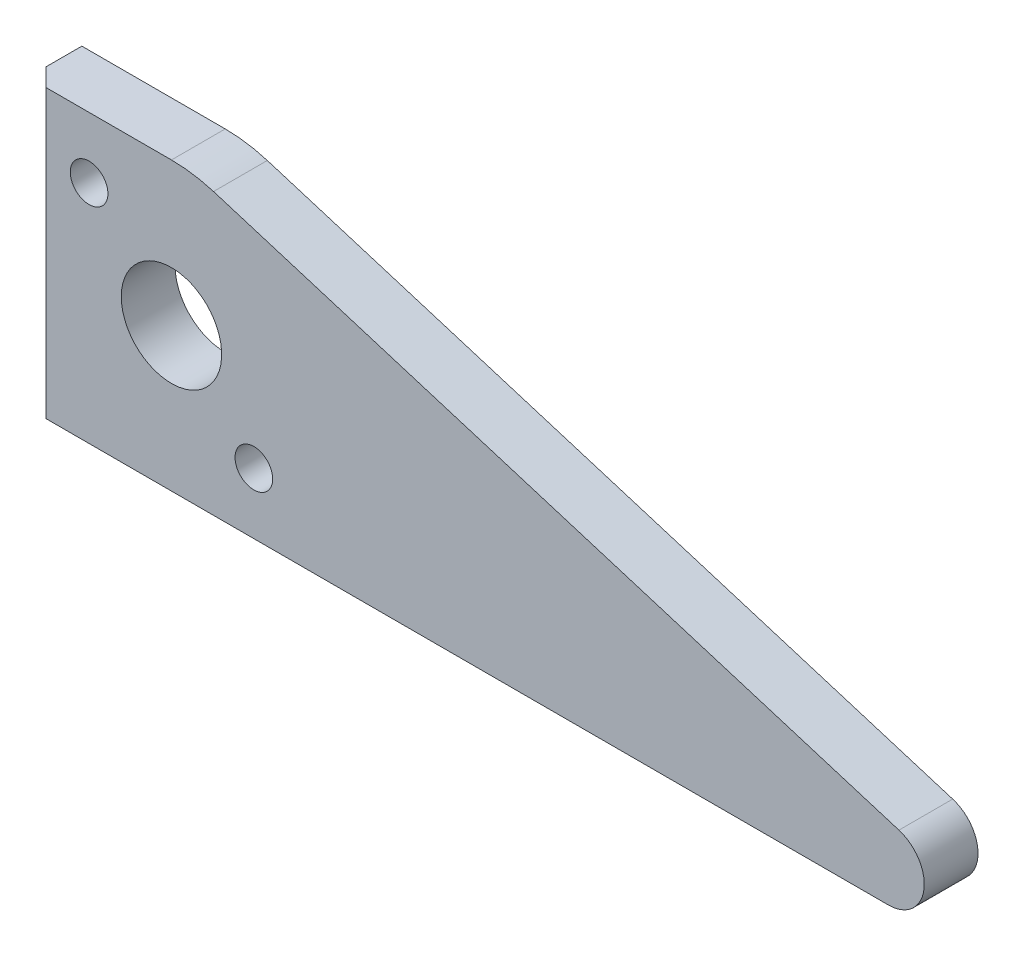
ISO-10303-21;
HEADER;
FILE_DESCRIPTION(('STEP AP214'),'2;1');
FILE_NAME('part.step','',(''),(''),'','','');
FILE_SCHEMA(('AUTOMOTIVE_DESIGN { 1 0 10303 214 1 1 1 1 }'));
ENDSEC;
DATA;
#1=APPLICATION_CONTEXT('core data for automotive mechanical design processes');
#2=APPLICATION_PROTOCOL_DEFINITION('international standard','automotive_design',2000,#1);
#3=PRODUCT_CONTEXT('',#1,'mechanical');
#4=PRODUCT('Part','Part','',(#3));
#5=PRODUCT_RELATED_PRODUCT_CATEGORY('part','',(#4));
#6=PRODUCT_DEFINITION_FORMATION('','',#4);
#7=PRODUCT_DEFINITION_CONTEXT('part definition',#1,'design');
#8=PRODUCT_DEFINITION('design','',#6,#7);
#9=PRODUCT_DEFINITION_SHAPE('','',#8);
#10=(LENGTH_UNIT() NAMED_UNIT(*) SI_UNIT(.MILLI.,.METRE.));
#11=(NAMED_UNIT(*) PLANE_ANGLE_UNIT() SI_UNIT($,.RADIAN.));
#12=(NAMED_UNIT(*) SI_UNIT($,.STERADIAN.) SOLID_ANGLE_UNIT());
#13=UNCERTAINTY_MEASURE_WITH_UNIT(LENGTH_MEASURE(1.E-05),#10,'distance_accuracy_value','');
#14=(GEOMETRIC_REPRESENTATION_CONTEXT(3) GLOBAL_UNCERTAINTY_ASSIGNED_CONTEXT((#13)) GLOBAL_UNIT_ASSIGNED_CONTEXT((#10,
#11,#12)) REPRESENTATION_CONTEXT('',''));
#15=CARTESIAN_POINT('',(0.,0.,0.));
#16=DIRECTION('',(0.,0.,1.));
#17=DIRECTION('',(1.,0.,0.));
#18=AXIS2_PLACEMENT_3D('',#15,#16,#17);
#19=CARTESIAN_POINT('',(-22.9809703885628,22.9809703885628,-5.));
#20=DIRECTION('',(0.,0.,1.));
#21=DIRECTION('',(1.,0.,0.));
#22=AXIS2_PLACEMENT_3D('',#19,#20,#21);
#23=CYLINDRICAL_SURFACE('',#22,3.);
#24=CARTESIAN_POINT('',(-22.9809703885628,22.9809703885628,0.));
#25=DIRECTION('',(0.,0.,1.));
#26=DIRECTION('',(1.,0.,0.));
#27=AXIS2_PLACEMENT_3D('',#24,#25,#26);
#28=CIRCLE('',#27,3.);
#29=CARTESIAN_POINT('',(-19.9809703885628,22.9809703885628,0.));
#30=VERTEX_POINT('',#29);
#31=EDGE_CURVE('E150',#30,#30,#28,.T.);
#32=ORIENTED_EDGE('',*,*,#31,.F.);
#33=EDGE_LOOP('',(#32));
#34=FACE_BOUND('',#33,.T.);
#35=CARTESIAN_POINT('',(-22.9809703885628,22.9809703885628,6.5));
#36=DIRECTION('',(0.,0.,1.));
#37=DIRECTION('',(1.,0.,0.));
#38=AXIS2_PLACEMENT_3D('',#35,#36,#37);
#39=CIRCLE('',#38,3.);
#40=CARTESIAN_POINT('',(-19.9809703885628,22.9809703885628,6.5));
#41=VERTEX_POINT('',#40);
#42=EDGE_CURVE('E139',#41,#41,#39,.F.);
#43=ORIENTED_EDGE('',*,*,#42,.F.);
#44=EDGE_LOOP('',(#43));
#45=FACE_BOUND('',#44,.T.);
#46=ADVANCED_FACE('F32',(#34,#45),#23,.F.);
#47=CARTESIAN_POINT('',(-40.,40.,15.));
#48=DIRECTION('',(1.,0.,0.));
#49=DIRECTION('',(0.,1.,0.));
#50=AXIS2_PLACEMENT_3D('',#47,#48,#49);
#51=PLANE('',#50);
#52=DIRECTION('',(0.,0.,-1.));
#53=VECTOR('',#52,1.);
#54=CARTESIAN_POINT('',(-40.,-40.,15.));
#55=LINE('',#54,#53);
#56=CARTESIAN_POINT('',(-40.,-40.,9.99999999999997));
#57=VERTEX_POINT('',#56);
#58=CARTESIAN_POINT('',(-40.,-40.,0.));
#59=VERTEX_POINT('',#58);
#60=EDGE_CURVE('E169',#57,#59,#55,.T.);
#61=ORIENTED_EDGE('',*,*,#60,.F.);
#62=DIRECTION('',(0.,1.,0.));
#63=VECTOR('',#62,1.);
#64=CARTESIAN_POINT('',(-40.,40.,9.99999999999997));
#65=LINE('',#64,#63);
#66=CARTESIAN_POINT('',(-40.,40.,9.99999999999997));
#67=VERTEX_POINT('',#66);
#68=EDGE_CURVE('E41',#57,#67,#65,.T.);
#69=ORIENTED_EDGE('',*,*,#68,.T.);
#70=DIRECTION('',(0.,0.,-1.));
#71=VECTOR('',#70,1.);
#72=CARTESIAN_POINT('',(-40.,40.,15.));
#73=LINE('',#72,#71);
#74=CARTESIAN_POINT('',(-40.,40.,0.));
#75=VERTEX_POINT('',#74);
#76=EDGE_CURVE('E156',#67,#75,#73,.T.);
#77=ORIENTED_EDGE('',*,*,#76,.T.);
#78=DIRECTION('',(0.,-1.,0.));
#79=VECTOR('',#78,1.);
#80=CARTESIAN_POINT('',(-40.,40.,0.));
#81=LINE('',#80,#79);
#82=EDGE_CURVE('E146',#75,#59,#81,.T.);
#83=ORIENTED_EDGE('',*,*,#82,.T.);
#84=EDGE_LOOP('',(#61,#69,#77,#83));
#85=FACE_BOUND('',#84,.T.);
#86=ADVANCED_FACE('F186',(#85),#51,.F.);
#87=CARTESIAN_POINT('',(-40.,-40.,15.));
#88=DIRECTION('',(0.,1.,0.));
#89=DIRECTION('',(0.,0.,1.));
#90=AXIS2_PLACEMENT_3D('',#87,#88,#89);
#91=PLANE('',#90);
#92=DIRECTION('',(1.,0.,0.));
#93=VECTOR('',#92,1.);
#94=CARTESIAN_POINT('',(-40.,-40.,15.));
#95=LINE('',#94,#93);
#96=CARTESIAN_POINT('',(-35.,-40.,15.));
#97=VERTEX_POINT('',#96);
#98=CARTESIAN_POINT('',(200.,-40.,15.));
#99=VERTEX_POINT('',#98);
#100=EDGE_CURVE('E115',#97,#99,#95,.T.);
#101=ORIENTED_EDGE('',*,*,#100,.F.);
#102=DIRECTION('',(-0.707106781186546,0.,-0.707106781186549));
#103=VECTOR('',#102,1.);
#104=CARTESIAN_POINT('',(-35.,-40.,15.));
#105=LINE('',#104,#103);
#106=EDGE_CURVE('E173',#97,#57,#105,.T.);
#107=ORIENTED_EDGE('',*,*,#106,.T.);
#108=ORIENTED_EDGE('',*,*,#60,.T.);
#109=DIRECTION('',(1.,0.,0.));
#110=VECTOR('',#109,1.);
#111=CARTESIAN_POINT('',(-40.,-40.,0.));
#112=LINE('',#111,#110);
#113=CARTESIAN_POINT('',(200.,-40.,0.));
#114=VERTEX_POINT('',#113);
#115=EDGE_CURVE('E159',#59,#114,#112,.T.);
#116=ORIENTED_EDGE('',*,*,#115,.T.);
#117=DIRECTION('',(0.,0.,1.));
#118=VECTOR('',#117,1.);
#119=CARTESIAN_POINT('',(200.,-40.,-224.101397553614));
#120=LINE('',#119,#118);
#121=EDGE_CURVE('E125',#114,#99,#120,.T.);
#122=ORIENTED_EDGE('',*,*,#121,.T.);
#123=EDGE_LOOP('',(#101,#107,#108,#116,#122));
#124=FACE_BOUND('',#123,.T.);
#125=ADVANCED_FACE('F192',(#124),#91,.F.);
#126=CARTESIAN_POINT('',(0.,0.,15.));
#127=DIRECTION('',(0.,0.,-1.));
#128=DIRECTION('',(-1.,0.,0.));
#129=AXIS2_PLACEMENT_3D('',#126,#127,#128);
#130=CYLINDRICAL_SURFACE('',#129,40.);
#131=CARTESIAN_POINT('',(0.,0.,15.));
#132=DIRECTION('',(0.,0.,1.));
#133=DIRECTION('',(1.,0.,0.));
#134=AXIS2_PLACEMENT_3D('',#131,#132,#133);
#135=CIRCLE('',#134,40.);
#136=CARTESIAN_POINT('',(11.7359413202934,38.239608801956,15.));
#137=VERTEX_POINT('',#136);
#138=CARTESIAN_POINT('',(0.,40.,15.));
#139=VERTEX_POINT('',#138);
#140=EDGE_CURVE('E49',#137,#139,#135,.T.);
#141=ORIENTED_EDGE('',*,*,#140,.F.);
#142=DIRECTION('',(0.,0.,1.));
#143=VECTOR('',#142,1.);
#144=CARTESIAN_POINT('',(11.7359413202934,38.239608801956,-224.101397553614));
#145=LINE('',#144,#143);
#146=CARTESIAN_POINT('',(11.7359413202934,38.239608801956,0.));
#147=VERTEX_POINT('',#146);
#148=EDGE_CURVE('E104',#147,#137,#145,.T.);
#149=ORIENTED_EDGE('',*,*,#148,.F.);
#150=CARTESIAN_POINT('',(0.,0.,0.));
#151=DIRECTION('',(0.,0.,1.));
#152=DIRECTION('',(1.,0.,0.));
#153=AXIS2_PLACEMENT_3D('',#150,#151,#152);
#154=CIRCLE('',#153,40.);
#155=CARTESIAN_POINT('',(0.,40.,0.));
#156=VERTEX_POINT('',#155);
#157=EDGE_CURVE('E161',#147,#156,#154,.T.);
#158=ORIENTED_EDGE('',*,*,#157,.T.);
#159=DIRECTION('',(0.,0.,-1.));
#160=VECTOR('',#159,1.);
#161=CARTESIAN_POINT('',(0.,40.,15.));
#162=LINE('',#161,#160);
#163=EDGE_CURVE('E166',#139,#156,#162,.T.);
#164=ORIENTED_EDGE('',*,*,#163,.F.);
#165=EDGE_LOOP('',(#141,#149,#158,#164));
#166=FACE_BOUND('',#165,.T.);
#167=ADVANCED_FACE('F212',(#166),#130,.T.);
#168=CARTESIAN_POINT('',(-40.,40.,15.));
#169=DIRECTION('',(0.,-1.,0.));
#170=DIRECTION('',(1.,0.,0.));
#171=AXIS2_PLACEMENT_3D('',#168,#169,#170);
#172=PLANE('',#171);
#173=ORIENTED_EDGE('',*,*,#76,.F.);
#174=DIRECTION('',(0.707106781186546,0.,0.707106781186549));
#175=VECTOR('',#174,1.);
#176=CARTESIAN_POINT('',(-35.,40.,15.));
#177=LINE('',#176,#175);
#178=CARTESIAN_POINT('',(-35.,40.,15.));
#179=VERTEX_POINT('',#178);
#180=EDGE_CURVE('E11',#67,#179,#177,.T.);
#181=ORIENTED_EDGE('',*,*,#180,.T.);
#182=DIRECTION('',(-1.,0.,0.));
#183=VECTOR('',#182,1.);
#184=CARTESIAN_POINT('',(-40.,40.,15.));
#185=LINE('',#184,#183);
#186=EDGE_CURVE('E154',#139,#179,#185,.T.);
#187=ORIENTED_EDGE('',*,*,#186,.F.);
#188=ORIENTED_EDGE('',*,*,#163,.T.);
#189=DIRECTION('',(-1.,0.,0.));
#190=VECTOR('',#189,1.);
#191=CARTESIAN_POINT('',(-40.,40.,0.));
#192=LINE('',#191,#190);
#193=EDGE_CURVE('E152',#156,#75,#192,.T.);
#194=ORIENTED_EDGE('',*,*,#193,.T.);
#195=EDGE_LOOP('',(#173,#181,#187,#188,#194));
#196=FACE_BOUND('',#195,.T.);
#197=ADVANCED_FACE('F205',(#196),#172,.F.);
#198=CARTESIAN_POINT('',(0.,0.,15.));
#199=DIRECTION('',(0.,0.,1.));
#200=DIRECTION('',(1.,0.,0.));
#201=AXIS2_PLACEMENT_3D('',#198,#199,#200);
#202=PLANE('',#201);
#203=CARTESIAN_POINT('',(22.9809703885627,-22.9809703885628,15.));
#204=DIRECTION('',(0.,0.,1.));
#205=DIRECTION('',(-1.,0.,0.));
#206=AXIS2_PLACEMENT_3D('',#203,#204,#205);
#207=CIRCLE('',#206,5.25);
#208=CARTESIAN_POINT('',(17.7309703885627,-22.9809703885628,15.));
#209=VERTEX_POINT('',#208);
#210=EDGE_CURVE('E130',#209,#209,#207,.T.);
#211=ORIENTED_EDGE('',*,*,#210,.F.);
#212=EDGE_LOOP('',(#211));
#213=FACE_BOUND('',#212,.T.);
#214=CARTESIAN_POINT('',(-22.9809703885628,22.9809703885628,15.));
#215=DIRECTION('',(0.,0.,1.));
#216=DIRECTION('',(1.,0.,0.));
#217=AXIS2_PLACEMENT_3D('',#214,#215,#216);
#218=CIRCLE('',#217,5.25);
#219=CARTESIAN_POINT('',(-17.7309703885628,22.9809703885628,15.));
#220=VERTEX_POINT('',#219);
#221=EDGE_CURVE('E140',#220,#220,#218,.T.);
#222=ORIENTED_EDGE('',*,*,#221,.F.);
#223=EDGE_LOOP('',(#222));
#224=FACE_BOUND('',#223,.T.);
#225=CARTESIAN_POINT('',(0.,0.,15.));
#226=DIRECTION('',(0.,0.,-1.));
#227=DIRECTION('',(-1.,0.,0.));
#228=AXIS2_PLACEMENT_3D('',#225,#226,#227);
#229=CIRCLE('',#228,14.);
#230=CARTESIAN_POINT('',(-14.,0.,15.));
#231=VERTEX_POINT('',#230);
#232=EDGE_CURVE('E143',#231,#231,#229,.T.);
#233=ORIENTED_EDGE('',*,*,#232,.T.);
#234=EDGE_LOOP('',(#233));
#235=FACE_BOUND('',#234,.T.);
#236=ORIENTED_EDGE('',*,*,#186,.T.);
#237=DIRECTION('',(0.,-1.,0.));
#238=VECTOR('',#237,1.);
#239=CARTESIAN_POINT('',(-35.,-40.,15.));
#240=LINE('',#239,#238);
#241=EDGE_CURVE('E171',#179,#97,#240,.T.);
#242=ORIENTED_EDGE('',*,*,#241,.T.);
#243=ORIENTED_EDGE('',*,*,#100,.T.);
#244=CARTESIAN_POINT('',(200.,-30.,15.));
#245=DIRECTION('',(0.,0.,1.));
#246=DIRECTION('',(1.,0.,0.));
#247=AXIS2_PLACEMENT_3D('',#244,#245,#246);
#248=CIRCLE('',#247,9.99999999999999);
#249=CARTESIAN_POINT('',(202.933985330073,-20.440097799511,15.));
#250=VERTEX_POINT('',#249);
#251=EDGE_CURVE('E99',#99,#250,#248,.T.);
#252=ORIENTED_EDGE('',*,*,#251,.T.);
#253=DIRECTION('',(-0.9559902200489,0.293398533007335,0.));
#254=VECTOR('',#253,1.);
#255=CARTESIAN_POINT('',(11.7359413202934,38.239608801956,15.));
#256=LINE('',#255,#254);
#257=EDGE_CURVE('E105',#250,#137,#256,.T.);
#258=ORIENTED_EDGE('',*,*,#257,.T.);
#259=ORIENTED_EDGE('',*,*,#140,.T.);
#260=EDGE_LOOP('',(#236,#242,#243,#252,#258,#259));
#261=FACE_BOUND('',#260,.T.);
#262=ADVANCED_FACE('F112',(#213,#224,#235,#261),#202,.T.);
#263=CARTESIAN_POINT('',(0.,0.,0.));
#264=DIRECTION('',(0.,0.,1.));
#265=DIRECTION('',(1.,0.,0.));
#266=AXIS2_PLACEMENT_3D('',#263,#264,#265);
#267=PLANE('',#266);
#268=CARTESIAN_POINT('',(138.285904256858,-33.5,0.));
#269=DIRECTION('',(0.,0.,-1.));
#270=DIRECTION('',(-1.,0.,0.));
#271=AXIS2_PLACEMENT_3D('',#268,#269,#270);
#272=CIRCLE('',#271,2.99999999999999);
#273=CARTESIAN_POINT('',(135.285904256858,-33.5,0.));
#274=VERTEX_POINT('',#273);
#275=EDGE_CURVE('E393',#274,#274,#272,.T.);
#276=ORIENTED_EDGE('',*,*,#275,.F.);
#277=EDGE_LOOP('',(#276));
#278=FACE_BOUND('',#277,.T.);
#279=CARTESIAN_POINT('',(57.,-8.64840509856726,0.));
#280=DIRECTION('',(0.,0.,-1.));
#281=DIRECTION('',(-1.,0.,0.));
#282=AXIS2_PLACEMENT_3D('',#279,#280,#281);
#283=CIRCLE('',#282,3.);
#284=CARTESIAN_POINT('',(54.,-8.64840509856726,0.));
#285=VERTEX_POINT('',#284);
#286=EDGE_CURVE('E120',#285,#285,#283,.T.);
#287=ORIENTED_EDGE('',*,*,#286,.F.);
#288=EDGE_LOOP('',(#287));
#289=FACE_BOUND('',#288,.T.);
#290=CARTESIAN_POINT('',(22.9809703885627,-22.9809703885628,0.));
#291=DIRECTION('',(0.,0.,1.));
#292=DIRECTION('',(1.,0.,0.));
#293=AXIS2_PLACEMENT_3D('',#290,#291,#292);
#294=CIRCLE('',#293,3.);
#295=CARTESIAN_POINT('',(25.9809703885627,-22.9809703885628,0.));
#296=VERTEX_POINT('',#295);
#297=EDGE_CURVE('E178',#296,#296,#294,.T.);
#298=ORIENTED_EDGE('',*,*,#297,.T.);
#299=EDGE_LOOP('',(#298));
#300=FACE_BOUND('',#299,.T.);
#301=ORIENTED_EDGE('',*,*,#31,.T.);
#302=EDGE_LOOP('',(#301));
#303=FACE_BOUND('',#302,.T.);
#304=CARTESIAN_POINT('',(0.,0.,0.));
#305=DIRECTION('',(0.,0.,-1.));
#306=DIRECTION('',(-1.,0.,0.));
#307=AXIS2_PLACEMENT_3D('',#304,#305,#306);
#308=CIRCLE('',#307,14.);
#309=CARTESIAN_POINT('',(-14.,0.,0.));
#310=VERTEX_POINT('',#309);
#311=EDGE_CURVE('E147',#310,#310,#308,.T.);
#312=ORIENTED_EDGE('',*,*,#311,.F.);
#313=EDGE_LOOP('',(#312));
#314=FACE_BOUND('',#313,.T.);
#315=ORIENTED_EDGE('',*,*,#82,.F.);
#316=ORIENTED_EDGE('',*,*,#193,.F.);
#317=ORIENTED_EDGE('',*,*,#157,.F.);
#318=DIRECTION('',(0.9559902200489,-0.293398533007335,0.));
#319=VECTOR('',#318,1.);
#320=CARTESIAN_POINT('',(11.7359413202934,38.239608801956,0.));
#321=LINE('',#320,#319);
#322=CARTESIAN_POINT('',(202.933985330073,-20.440097799511,0.));
#323=VERTEX_POINT('',#322);
#324=EDGE_CURVE('E128',#147,#323,#321,.T.);
#325=ORIENTED_EDGE('',*,*,#324,.T.);
#326=CARTESIAN_POINT('',(200.,-30.,0.));
#327=DIRECTION('',(0.,0.,1.));
#328=DIRECTION('',(1.,0.,0.));
#329=AXIS2_PLACEMENT_3D('',#326,#327,#328);
#330=CIRCLE('',#329,9.99999999999999);
#331=EDGE_CURVE('E101',#323,#114,#330,.F.);
#332=ORIENTED_EDGE('',*,*,#331,.T.);
#333=ORIENTED_EDGE('',*,*,#115,.F.);
#334=EDGE_LOOP('',(#315,#316,#317,#325,#332,#333));
#335=FACE_BOUND('',#334,.T.);
#336=ADVANCED_FACE('F204',(#278,#289,#300,#303,#314,#335),#267,.F.);
#337=CARTESIAN_POINT('',(-35.,0.,15.));
#338=DIRECTION('',(-0.707106781186549,0.,0.707106781186545));
#339=DIRECTION('',(0.707106781186546,0.,0.707106781186549));
#340=AXIS2_PLACEMENT_3D('',#337,#338,#339);
#341=PLANE('',#340);
#342=ORIENTED_EDGE('',*,*,#180,.F.);
#343=ORIENTED_EDGE('',*,*,#68,.F.);
#344=ORIENTED_EDGE('',*,*,#106,.F.);
#345=ORIENTED_EDGE('',*,*,#241,.F.);
#346=EDGE_LOOP('',(#342,#343,#344,#345));
#347=FACE_BOUND('',#346,.T.);
#348=ADVANCED_FACE('F34',(#347),#341,.T.);
#349=CARTESIAN_POINT('',(0.,0.,15.));
#350=DIRECTION('',(0.,0.,-1.));
#351=DIRECTION('',(-1.,0.,0.));
#352=AXIS2_PLACEMENT_3D('',#349,#350,#351);
#353=CYLINDRICAL_SURFACE('',#352,14.);
#354=ORIENTED_EDGE('',*,*,#232,.F.);
#355=EDGE_LOOP('',(#354));
#356=FACE_BOUND('',#355,.T.);
#357=ORIENTED_EDGE('',*,*,#311,.T.);
#358=EDGE_LOOP('',(#357));
#359=FACE_BOUND('',#358,.T.);
#360=ADVANCED_FACE('F198',(#356,#359),#353,.F.);
#361=CARTESIAN_POINT('',(22.9809703885627,-22.9809703885628,-5.));
#362=DIRECTION('',(0.,0.,1.));
#363=DIRECTION('',(1.,0.,0.));
#364=AXIS2_PLACEMENT_3D('',#361,#362,#363);
#365=CYLINDRICAL_SURFACE('',#364,3.);
#366=CARTESIAN_POINT('',(22.9809703885627,-22.9809703885628,6.5));
#367=DIRECTION('',(0.,0.,-1.));
#368=DIRECTION('',(-1.,0.,0.));
#369=AXIS2_PLACEMENT_3D('',#366,#367,#368);
#370=CIRCLE('',#369,3.);
#371=CARTESIAN_POINT('',(19.9809703885627,-22.9809703885628,6.5));
#372=VERTEX_POINT('',#371);
#373=EDGE_CURVE('E36',#372,#372,#370,.F.);
#374=ORIENTED_EDGE('',*,*,#373,.T.);
#375=EDGE_LOOP('',(#374));
#376=FACE_BOUND('',#375,.T.);
#377=ORIENTED_EDGE('',*,*,#297,.F.);
#378=EDGE_LOOP('',(#377));
#379=FACE_BOUND('',#378,.T.);
#380=ADVANCED_FACE('F196',(#376,#379),#365,.F.);
#381=CARTESIAN_POINT('',(-22.9809703885628,22.9809703885628,6.5));
#382=DIRECTION('',(0.,0.,1.));
#383=DIRECTION('',(1.,0.,0.));
#384=AXIS2_PLACEMENT_3D('',#381,#382,#383);
#385=PLANE('',#384);
#386=CARTESIAN_POINT('',(-22.9809703885628,22.9809703885628,6.5));
#387=DIRECTION('',(0.,0.,1.));
#388=DIRECTION('',(1.,0.,0.));
#389=AXIS2_PLACEMENT_3D('',#386,#387,#388);
#390=CIRCLE('',#389,5.25);
#391=CARTESIAN_POINT('',(-17.7309703885628,22.9809703885628,6.5));
#392=VERTEX_POINT('',#391);
#393=EDGE_CURVE('E136',#392,#392,#390,.T.);
#394=ORIENTED_EDGE('',*,*,#393,.T.);
#395=EDGE_LOOP('',(#394));
#396=FACE_BOUND('',#395,.T.);
#397=ORIENTED_EDGE('',*,*,#42,.T.);
#398=EDGE_LOOP('',(#397));
#399=FACE_BOUND('',#398,.T.);
#400=ADVANCED_FACE('F183',(#396,#399),#385,.T.);
#401=CARTESIAN_POINT('',(-22.9809703885628,22.9809703885628,6.5));
#402=DIRECTION('',(0.,0.,1.));
#403=DIRECTION('',(1.,0.,0.));
#404=AXIS2_PLACEMENT_3D('',#401,#402,#403);
#405=CYLINDRICAL_SURFACE('',#404,5.25);
#406=ORIENTED_EDGE('',*,*,#393,.F.);
#407=EDGE_LOOP('',(#406));
#408=FACE_BOUND('',#407,.T.);
#409=ORIENTED_EDGE('',*,*,#221,.T.);
#410=EDGE_LOOP('',(#409));
#411=FACE_BOUND('',#410,.T.);
#412=ADVANCED_FACE('F250',(#408,#411),#405,.F.);
#413=CARTESIAN_POINT('',(22.9809703885627,-22.9809703885628,6.5));
#414=DIRECTION('',(0.,0.,-1.));
#415=DIRECTION('',(-1.,0.,0.));
#416=AXIS2_PLACEMENT_3D('',#413,#414,#415);
#417=PLANE('',#416);
#418=CARTESIAN_POINT('',(22.9809703885627,-22.9809703885628,6.5));
#419=DIRECTION('',(0.,0.,1.));
#420=DIRECTION('',(-1.,0.,0.));
#421=AXIS2_PLACEMENT_3D('',#418,#419,#420);
#422=CIRCLE('',#421,5.25);
#423=CARTESIAN_POINT('',(17.7309703885627,-22.9809703885628,6.5));
#424=VERTEX_POINT('',#423);
#425=EDGE_CURVE('E131',#424,#424,#422,.T.);
#426=ORIENTED_EDGE('',*,*,#425,.T.);
#427=EDGE_LOOP('',(#426));
#428=FACE_BOUND('',#427,.T.);
#429=ORIENTED_EDGE('',*,*,#373,.F.);
#430=EDGE_LOOP('',(#429));
#431=FACE_BOUND('',#430,.T.);
#432=ADVANCED_FACE('F258',(#428,#431),#417,.F.);
#433=CARTESIAN_POINT('',(22.9809703885627,-22.9809703885628,6.5));
#434=DIRECTION('',(0.,0.,1.));
#435=DIRECTION('',(1.,0.,0.));
#436=AXIS2_PLACEMENT_3D('',#433,#434,#435);
#437=CYLINDRICAL_SURFACE('',#436,5.25);
#438=ORIENTED_EDGE('',*,*,#425,.F.);
#439=EDGE_LOOP('',(#438));
#440=FACE_BOUND('',#439,.T.);
#441=ORIENTED_EDGE('',*,*,#210,.T.);
#442=EDGE_LOOP('',(#441));
#443=FACE_BOUND('',#442,.T.);
#444=ADVANCED_FACE('F265',(#440,#443),#437,.F.);
#445=CARTESIAN_POINT('',(200.,-30.,-224.101397553614));
#446=DIRECTION('',(0.,0.,1.));
#447=DIRECTION('',(1.,0.,0.));
#448=AXIS2_PLACEMENT_3D('',#445,#446,#447);
#449=CYLINDRICAL_SURFACE('',#448,9.99999999999999);
#450=ORIENTED_EDGE('',*,*,#331,.F.);
#451=DIRECTION('',(0.,0.,1.));
#452=VECTOR('',#451,1.);
#453=CARTESIAN_POINT('',(202.933985330073,-20.440097799511,-224.101397553614));
#454=LINE('',#453,#452);
#455=EDGE_CURVE('E94',#323,#250,#454,.T.);
#456=ORIENTED_EDGE('',*,*,#455,.T.);
#457=ORIENTED_EDGE('',*,*,#251,.F.);
#458=ORIENTED_EDGE('',*,*,#121,.F.);
#459=EDGE_LOOP('',(#450,#456,#457,#458));
#460=FACE_BOUND('',#459,.T.);
#461=ADVANCED_FACE('F96',(#460),#449,.T.);
#462=CARTESIAN_POINT('',(11.7359413202934,38.239608801956,-224.101397553614));
#463=DIRECTION('',(0.293398533007335,0.9559902200489,0.));
#464=DIRECTION('',(-0.9559902200489,0.293398533007335,0.));
#465=AXIS2_PLACEMENT_3D('',#462,#463,#464);
#466=PLANE('',#465);
#467=ORIENTED_EDGE('',*,*,#324,.F.);
#468=ORIENTED_EDGE('',*,*,#148,.T.);
#469=ORIENTED_EDGE('',*,*,#257,.F.);
#470=ORIENTED_EDGE('',*,*,#455,.F.);
#471=EDGE_LOOP('',(#467,#468,#469,#470));
#472=FACE_BOUND('',#471,.T.);
#473=ADVANCED_FACE('F108',(#472),#466,.T.);
#474=CARTESIAN_POINT('',(57.,-8.64840509856726,10.));
#475=DIRECTION('',(0.,0.,-1.));
#476=DIRECTION('',(-1.,0.,0.));
#477=AXIS2_PLACEMENT_3D('',#474,#475,#476);
#478=CYLINDRICAL_SURFACE('',#477,3.);
#479=CARTESIAN_POINT('',(57.,-8.64840509856726,10.));
#480=DIRECTION('',(0.,0.,-1.));
#481=DIRECTION('',(-1.,0.,0.));
#482=AXIS2_PLACEMENT_3D('',#479,#480,#481);
#483=CIRCLE('',#482,3.);
#484=CARTESIAN_POINT('',(54.,-8.64840509856726,10.));
#485=VERTEX_POINT('',#484);
#486=EDGE_CURVE('E117',#485,#485,#483,.T.);
#487=ORIENTED_EDGE('',*,*,#486,.F.);
#488=EDGE_LOOP('',(#487));
#489=FACE_BOUND('',#488,.T.);
#490=ORIENTED_EDGE('',*,*,#286,.T.);
#491=EDGE_LOOP('',(#490));
#492=FACE_BOUND('',#491,.T.);
#493=ADVANCED_FACE('F287',(#489,#492),#478,.F.);
#494=CARTESIAN_POINT('',(57.,-8.64840509856726,10.));
#495=DIRECTION('',(0.,0.,-1.));
#496=DIRECTION('',(-1.,0.,0.));
#497=AXIS2_PLACEMENT_3D('',#494,#495,#496);
#498=PLANE('',#497);
#499=ORIENTED_EDGE('',*,*,#486,.T.);
#500=EDGE_LOOP('',(#499));
#501=FACE_BOUND('',#500,.T.);
#502=ADVANCED_FACE('F294',(#501),#498,.T.);
#503=CARTESIAN_POINT('',(138.285904256858,-33.5,10.));
#504=DIRECTION('',(0.,0.,-1.));
#505=DIRECTION('',(-1.,0.,0.));
#506=AXIS2_PLACEMENT_3D('',#503,#504,#505);
#507=CYLINDRICAL_SURFACE('',#506,2.99999999999999);
#508=CARTESIAN_POINT('',(138.285904256858,-33.5,10.));
#509=DIRECTION('',(0.,0.,-1.));
#510=DIRECTION('',(-1.,0.,0.));
#511=AXIS2_PLACEMENT_3D('',#508,#509,#510);
#512=CIRCLE('',#511,2.99999999999999);
#513=CARTESIAN_POINT('',(135.285904256858,-33.5,10.));
#514=VERTEX_POINT('',#513);
#515=EDGE_CURVE('E392',#514,#514,#512,.T.);
#516=ORIENTED_EDGE('',*,*,#515,.F.);
#517=EDGE_LOOP('',(#516));
#518=FACE_BOUND('',#517,.T.);
#519=ORIENTED_EDGE('',*,*,#275,.T.);
#520=EDGE_LOOP('',(#519));
#521=FACE_BOUND('',#520,.T.);
#522=ADVANCED_FACE('F302',(#518,#521),#507,.F.);
#523=CARTESIAN_POINT('',(138.285904256858,-33.5,10.));
#524=DIRECTION('',(0.,0.,-1.));
#525=DIRECTION('',(-1.,0.,0.));
#526=AXIS2_PLACEMENT_3D('',#523,#524,#525);
#527=PLANE('',#526);
#528=ORIENTED_EDGE('',*,*,#515,.T.);
#529=EDGE_LOOP('',(#528));
#530=FACE_BOUND('',#529,.T.);
#531=ADVANCED_FACE('F310',(#530),#527,.T.);
#532=CLOSED_SHELL('',(#46,#86,#125,#167,#197,#262,#336,#348,#360,#380,#400,#412,#432,#444,#461,
#473,#493,#502,#522,#531));
#533=MANIFOLD_SOLID_BREP('B2',#532);
#534=ADVANCED_BREP_SHAPE_REPRESENTATION('',(#18,#533),#14);
#535=SHAPE_DEFINITION_REPRESENTATION(#9,#534);
ENDSEC;
END-ISO-10303-21;
